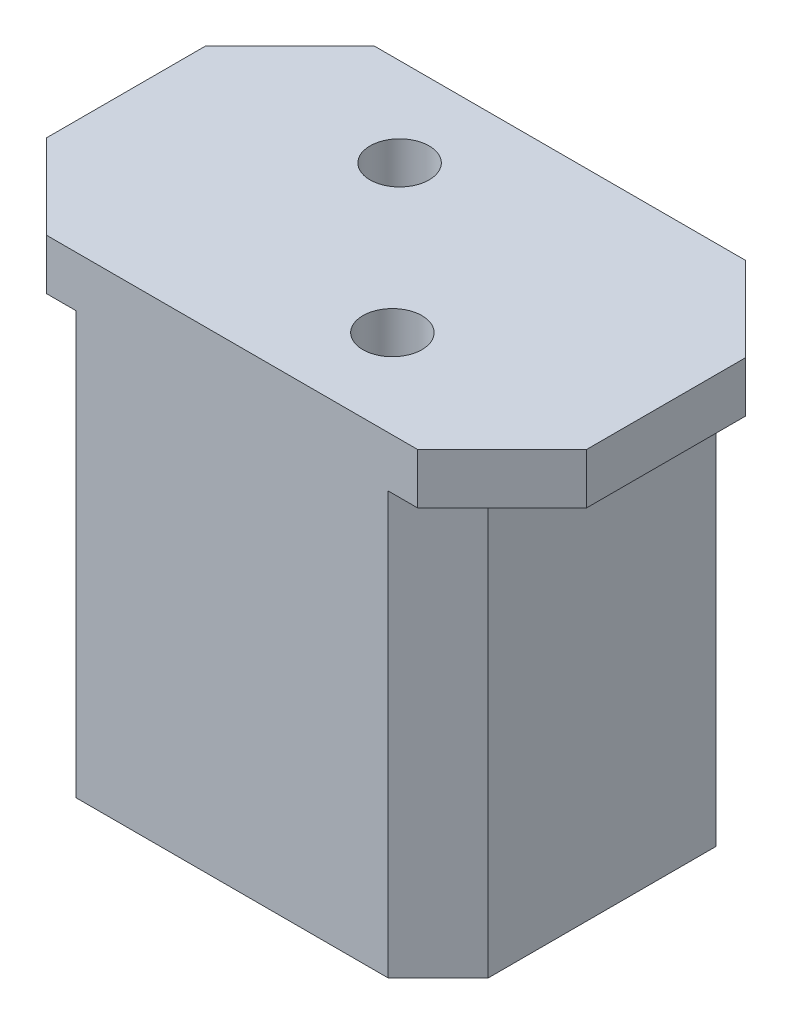
ISO-10303-21;
HEADER;
FILE_DESCRIPTION(('STEP AP214'),'2;1');
FILE_NAME('part.step','',(''),(''),'','','');
FILE_SCHEMA(('AUTOMOTIVE_DESIGN { 1 0 10303 214 1 1 1 1 }'));
ENDSEC;
DATA;
#1=APPLICATION_CONTEXT('core data for automotive mechanical design processes');
#2=APPLICATION_PROTOCOL_DEFINITION('international standard','automotive_design',2000,#1);
#3=PRODUCT_CONTEXT('',#1,'mechanical');
#4=PRODUCT('Part','Part','',(#3));
#5=PRODUCT_RELATED_PRODUCT_CATEGORY('part','',(#4));
#6=PRODUCT_DEFINITION_FORMATION('','',#4);
#7=PRODUCT_DEFINITION_CONTEXT('part definition',#1,'design');
#8=PRODUCT_DEFINITION('design','',#6,#7);
#9=PRODUCT_DEFINITION_SHAPE('','',#8);
#10=(LENGTH_UNIT() NAMED_UNIT(*) SI_UNIT(.MILLI.,.METRE.));
#11=(NAMED_UNIT(*) PLANE_ANGLE_UNIT() SI_UNIT($,.RADIAN.));
#12=(NAMED_UNIT(*) SI_UNIT($,.STERADIAN.) SOLID_ANGLE_UNIT());
#13=UNCERTAINTY_MEASURE_WITH_UNIT(LENGTH_MEASURE(1.E-05),#10,'distance_accuracy_value','');
#14=(GEOMETRIC_REPRESENTATION_CONTEXT(3) GLOBAL_UNCERTAINTY_ASSIGNED_CONTEXT((#13)) GLOBAL_UNIT_ASSIGNED_CONTEXT((#10,
#11,#12)) REPRESENTATION_CONTEXT('',''));
#15=CARTESIAN_POINT('',(0.,0.,0.));
#16=DIRECTION('',(0.,0.,1.));
#17=DIRECTION('',(1.,0.,0.));
#18=AXIS2_PLACEMENT_3D('',#15,#16,#17);
#19=CARTESIAN_POINT('',(2.96277741317163,25.,2.96277741317163));
#20=DIRECTION('',(0.707106781186547,0.,-0.707106781186547));
#21=DIRECTION('',(-0.707106781186548,0.,-0.707106781186548));
#22=AXIS2_PLACEMENT_3D('',#19,#20,#21);
#23=PLANE('',#22);
#24=DIRECTION('',(0.707106781186547,0.,0.707106781186547));
#25=VECTOR('',#24,1.);
#26=CARTESIAN_POINT('',(2.96277741317163,0.,2.96277741317163));
#27=LINE('',#26,#25);
#28=CARTESIAN_POINT('',(0.,0.,0.));
#29=VERTEX_POINT('',#28);
#30=CARTESIAN_POINT('',(2.96277741317163,0.,2.96277741317163));
#31=VERTEX_POINT('',#30);
#32=EDGE_CURVE('E224',#29,#31,#27,.T.);
#33=ORIENTED_EDGE('',*,*,#32,.T.);
#34=DIRECTION('',(0.,-1.,0.));
#35=VECTOR('',#34,1.);
#36=CARTESIAN_POINT('',(2.96277741317163,25.,2.96277741317163));
#37=LINE('',#36,#35);
#38=CARTESIAN_POINT('',(2.96277741317163,25.,2.96277741317163));
#39=VERTEX_POINT('',#38);
#40=EDGE_CURVE('E202',#39,#31,#37,.T.);
#41=ORIENTED_EDGE('',*,*,#40,.F.);
#42=DIRECTION('',(0.707106781186547,0.,0.707106781186547));
#43=VECTOR('',#42,1.);
#44=CARTESIAN_POINT('',(2.96277741317163,25.,2.96277741317163));
#45=LINE('',#44,#43);
#46=CARTESIAN_POINT('',(0.,25.,0.));
#47=VERTEX_POINT('',#46);
#48=EDGE_CURVE('E196',#47,#39,#45,.T.);
#49=ORIENTED_EDGE('',*,*,#48,.F.);
#50=DIRECTION('',(0.,-1.,0.));
#51=VECTOR('',#50,1.);
#52=CARTESIAN_POINT('',(0.,25.,0.));
#53=LINE('',#52,#51);
#54=EDGE_CURVE('E199',#47,#29,#53,.T.);
#55=ORIENTED_EDGE('',*,*,#54,.T.);
#56=EDGE_LOOP('',(#33,#41,#49,#55));
#57=FACE_BOUND('',#56,.T.);
#58=ADVANCED_FACE('F35',(#57),#23,.F.);
#59=CARTESIAN_POINT('',(21.4627774131716,25.,2.96277741317163));
#60=DIRECTION('',(0.,0.,-1.));
#61=DIRECTION('',(-1.,0.,0.));
#62=AXIS2_PLACEMENT_3D('',#59,#60,#61);
#63=PLANE('',#62);
#64=DIRECTION('',(1.,0.,0.));
#65=VECTOR('',#64,1.);
#66=CARTESIAN_POINT('',(-3.78722258682836,25.,2.96277741317163));
#67=LINE('',#66,#65);
#68=CARTESIAN_POINT('',(21.4627774131716,25.,2.96277741317163));
#69=VERTEX_POINT('',#68);
#70=CARTESIAN_POINT('',(23.2127774131716,25.,2.96277741317163));
#71=VERTEX_POINT('',#70);
#72=EDGE_CURVE('E307',#69,#71,#67,.T.);
#73=ORIENTED_EDGE('',*,*,#72,.T.);
#74=DIRECTION('',(0.,1.,0.));
#75=VECTOR('',#74,1.);
#76=CARTESIAN_POINT('',(23.2127774131716,25.,2.96277741317163));
#77=LINE('',#76,#75);
#78=CARTESIAN_POINT('',(23.2127774131716,28.,2.96277741317163));
#79=VERTEX_POINT('',#78);
#80=EDGE_CURVE('E269',#71,#79,#77,.T.);
#81=ORIENTED_EDGE('',*,*,#80,.T.);
#82=DIRECTION('',(1.,0.,0.));
#83=VECTOR('',#82,1.);
#84=CARTESIAN_POINT('',(-3.78722258682836,28.,2.96277741317163));
#85=LINE('',#84,#83);
#86=CARTESIAN_POINT('',(1.21277741317164,28.,2.96277741317163));
#87=VERTEX_POINT('',#86);
#88=EDGE_CURVE('E320',#87,#79,#85,.T.);
#89=ORIENTED_EDGE('',*,*,#88,.F.);
#90=DIRECTION('',(0.,-1.,0.));
#91=VECTOR('',#90,1.);
#92=CARTESIAN_POINT('',(1.21277741317164,25.,2.96277741317163));
#93=LINE('',#92,#91);
#94=CARTESIAN_POINT('',(1.21277741317164,25.,2.96277741317163));
#95=VERTEX_POINT('',#94);
#96=EDGE_CURVE('E266',#87,#95,#93,.T.);
#97=ORIENTED_EDGE('',*,*,#96,.T.);
#98=EDGE_CURVE('E313',#95,#39,#67,.T.);
#99=ORIENTED_EDGE('',*,*,#98,.T.);
#100=ORIENTED_EDGE('',*,*,#40,.T.);
#101=DIRECTION('',(1.,0.,0.));
#102=VECTOR('',#101,1.);
#103=CARTESIAN_POINT('',(21.4627774131716,0.,2.96277741317163));
#104=LINE('',#103,#102);
#105=CARTESIAN_POINT('',(21.4627774131716,0.,2.96277741317163));
#106=VERTEX_POINT('',#105);
#107=EDGE_CURVE('E226',#31,#106,#104,.T.);
#108=ORIENTED_EDGE('',*,*,#107,.T.);
#109=DIRECTION('',(0.,-1.,0.));
#110=VECTOR('',#109,1.);
#111=CARTESIAN_POINT('',(21.4627774131716,25.,2.96277741317163));
#112=LINE('',#111,#110);
#113=EDGE_CURVE('E253',#69,#106,#112,.T.);
#114=ORIENTED_EDGE('',*,*,#113,.F.);
#115=EDGE_LOOP('',(#73,#81,#89,#97,#99,#100,#108,#114));
#116=FACE_BOUND('',#115,.T.);
#117=ADVANCED_FACE('F435',(#116),#63,.F.);
#118=CARTESIAN_POINT('',(24.4255548263433,25.,0.));
#119=DIRECTION('',(-0.707106781186547,0.,-0.707106781186548));
#120=DIRECTION('',(-0.707106781186548,0.,0.707106781186547));
#121=AXIS2_PLACEMENT_3D('',#118,#119,#120);
#122=PLANE('',#121);
#123=DIRECTION('',(0.707106781186548,0.,-0.707106781186547));
#124=VECTOR('',#123,1.);
#125=CARTESIAN_POINT('',(24.4255548263433,0.,0.));
#126=LINE('',#125,#124);
#127=CARTESIAN_POINT('',(24.4255548263433,0.,0.));
#128=VERTEX_POINT('',#127);
#129=EDGE_CURVE('E229',#106,#128,#126,.T.);
#130=ORIENTED_EDGE('',*,*,#129,.T.);
#131=DIRECTION('',(0.,-1.,0.));
#132=VECTOR('',#131,1.);
#133=CARTESIAN_POINT('',(24.4255548263433,25.,0.));
#134=LINE('',#133,#132);
#135=CARTESIAN_POINT('',(24.4255548263433,25.,0.));
#136=VERTEX_POINT('',#135);
#137=EDGE_CURVE('E250',#136,#128,#134,.T.);
#138=ORIENTED_EDGE('',*,*,#137,.F.);
#139=DIRECTION('',(0.707106781186548,0.,-0.707106781186547));
#140=VECTOR('',#139,1.);
#141=CARTESIAN_POINT('',(24.4255548263433,25.,0.));
#142=LINE('',#141,#140);
#143=EDGE_CURVE('E204',#69,#136,#142,.T.);
#144=ORIENTED_EDGE('',*,*,#143,.F.);
#145=ORIENTED_EDGE('',*,*,#113,.T.);
#146=EDGE_LOOP('',(#130,#138,#144,#145));
#147=FACE_BOUND('',#146,.T.);
#148=ADVANCED_FACE('F442',(#147),#122,.F.);
#149=CARTESIAN_POINT('',(24.4255548263433,25.,-13.5));
#150=DIRECTION('',(-1.,0.,0.));
#151=DIRECTION('',(0.,0.,1.));
#152=AXIS2_PLACEMENT_3D('',#149,#150,#151);
#153=PLANE('',#152);
#154=DIRECTION('',(0.,0.,-1.));
#155=VECTOR('',#154,1.);
#156=CARTESIAN_POINT('',(24.4255548263433,0.,-13.5));
#157=LINE('',#156,#155);
#158=CARTESIAN_POINT('',(24.4255548263433,0.,-13.5));
#159=VERTEX_POINT('',#158);
#160=EDGE_CURVE('E231',#128,#159,#157,.T.);
#161=ORIENTED_EDGE('',*,*,#160,.T.);
#162=DIRECTION('',(0.,-1.,0.));
#163=VECTOR('',#162,1.);
#164=CARTESIAN_POINT('',(24.4255548263433,25.,-13.5));
#165=LINE('',#164,#163);
#166=CARTESIAN_POINT('',(24.4255548263433,25.,-13.5));
#167=VERTEX_POINT('',#166);
#168=EDGE_CURVE('E247',#167,#159,#165,.T.);
#169=ORIENTED_EDGE('',*,*,#168,.F.);
#170=DIRECTION('',(0.,0.,-1.));
#171=VECTOR('',#170,1.);
#172=CARTESIAN_POINT('',(24.4255548263433,25.,-13.5));
#173=LINE('',#172,#171);
#174=EDGE_CURVE('E380',#136,#167,#173,.T.);
#175=ORIENTED_EDGE('',*,*,#174,.F.);
#176=ORIENTED_EDGE('',*,*,#137,.T.);
#177=EDGE_LOOP('',(#161,#169,#175,#176));
#178=FACE_BOUND('',#177,.T.);
#179=ADVANCED_FACE('F385',(#178),#153,.F.);
#180=CARTESIAN_POINT('',(21.4627774131716,25.,-16.4627774131716));
#181=DIRECTION('',(-0.707106781186547,0.,0.707106781186547));
#182=DIRECTION('',(0.707106781186548,0.,0.707106781186548));
#183=AXIS2_PLACEMENT_3D('',#180,#181,#182);
#184=PLANE('',#183);
#185=DIRECTION('',(-0.707106781186547,0.,-0.707106781186547));
#186=VECTOR('',#185,1.);
#187=CARTESIAN_POINT('',(21.4627774131716,0.,-16.4627774131716));
#188=LINE('',#187,#186);
#189=CARTESIAN_POINT('',(21.4627774131716,0.,-16.4627774131716));
#190=VERTEX_POINT('',#189);
#191=EDGE_CURVE('E233',#159,#190,#188,.T.);
#192=ORIENTED_EDGE('',*,*,#191,.T.);
#193=DIRECTION('',(0.,-1.,0.));
#194=VECTOR('',#193,1.);
#195=CARTESIAN_POINT('',(21.4627774131716,25.,-16.4627774131716));
#196=LINE('',#195,#194);
#197=CARTESIAN_POINT('',(21.4627774131716,25.,-16.4627774131716));
#198=VERTEX_POINT('',#197);
#199=EDGE_CURVE('E244',#198,#190,#196,.T.);
#200=ORIENTED_EDGE('',*,*,#199,.F.);
#201=DIRECTION('',(-0.707106781186547,0.,-0.707106781186547));
#202=VECTOR('',#201,1.);
#203=CARTESIAN_POINT('',(21.4627774131716,25.,-16.4627774131716));
#204=LINE('',#203,#202);
#205=EDGE_CURVE('E220',#167,#198,#204,.T.);
#206=ORIENTED_EDGE('',*,*,#205,.F.);
#207=ORIENTED_EDGE('',*,*,#168,.T.);
#208=EDGE_LOOP('',(#192,#200,#206,#207));
#209=FACE_BOUND('',#208,.T.);
#210=ADVANCED_FACE('F389',(#209),#184,.F.);
#211=CARTESIAN_POINT('',(2.96277741317163,25.,-16.4627774131716));
#212=DIRECTION('',(0.,0.,1.));
#213=DIRECTION('',(1.,0.,0.));
#214=AXIS2_PLACEMENT_3D('',#211,#212,#213);
#215=PLANE('',#214);
#216=DIRECTION('',(-1.,0.,0.));
#217=VECTOR('',#216,1.);
#218=CARTESIAN_POINT('',(-3.78722258682836,25.,-16.4627774131716));
#219=LINE('',#218,#217);
#220=CARTESIAN_POINT('',(2.96277741317163,25.,-16.4627774131716));
#221=VERTEX_POINT('',#220);
#222=CARTESIAN_POINT('',(1.21277741317166,25.,-16.4627774131716));
#223=VERTEX_POINT('',#222);
#224=EDGE_CURVE('E305',#221,#223,#219,.T.);
#225=ORIENTED_EDGE('',*,*,#224,.T.);
#226=DIRECTION('',(0.,1.,0.));
#227=VECTOR('',#226,1.);
#228=CARTESIAN_POINT('',(1.21277741317166,25.,-16.4627774131716));
#229=LINE('',#228,#227);
#230=CARTESIAN_POINT('',(1.21277741317166,28.,-16.4627774131716));
#231=VERTEX_POINT('',#230);
#232=EDGE_CURVE('E12',#223,#231,#229,.T.);
#233=ORIENTED_EDGE('',*,*,#232,.T.);
#234=DIRECTION('',(-1.,0.,0.));
#235=VECTOR('',#234,1.);
#236=CARTESIAN_POINT('',(-3.78722258682836,28.,-16.4627774131716));
#237=LINE('',#236,#235);
#238=CARTESIAN_POINT('',(23.2127774131716,28.,-16.4627774131716));
#239=VERTEX_POINT('',#238);
#240=EDGE_CURVE('E294',#239,#231,#237,.T.);
#241=ORIENTED_EDGE('',*,*,#240,.F.);
#242=DIRECTION('',(0.,-1.,0.));
#243=VECTOR('',#242,1.);
#244=CARTESIAN_POINT('',(23.2127774131716,25.,-16.4627774131716));
#245=LINE('',#244,#243);
#246=CARTESIAN_POINT('',(23.2127774131716,25.,-16.4627774131716));
#247=VERTEX_POINT('',#246);
#248=EDGE_CURVE('E43',#239,#247,#245,.T.);
#249=ORIENTED_EDGE('',*,*,#248,.T.);
#250=EDGE_CURVE('E291',#247,#198,#219,.T.);
#251=ORIENTED_EDGE('',*,*,#250,.T.);
#252=ORIENTED_EDGE('',*,*,#199,.T.);
#253=DIRECTION('',(-1.,0.,0.));
#254=VECTOR('',#253,1.);
#255=CARTESIAN_POINT('',(2.96277741317163,0.,-16.4627774131716));
#256=LINE('',#255,#254);
#257=CARTESIAN_POINT('',(2.96277741317163,0.,-16.4627774131716));
#258=VERTEX_POINT('',#257);
#259=EDGE_CURVE('E235',#190,#258,#256,.T.);
#260=ORIENTED_EDGE('',*,*,#259,.T.);
#261=DIRECTION('',(0.,-1.,0.));
#262=VECTOR('',#261,1.);
#263=CARTESIAN_POINT('',(2.96277741317163,25.,-16.4627774131716));
#264=LINE('',#263,#262);
#265=EDGE_CURVE('E241',#221,#258,#264,.T.);
#266=ORIENTED_EDGE('',*,*,#265,.F.);
#267=EDGE_LOOP('',(#225,#233,#241,#249,#251,#252,#260,#266));
#268=FACE_BOUND('',#267,.T.);
#269=ADVANCED_FACE('F290',(#268),#215,.F.);
#270=CARTESIAN_POINT('',(0.,25.,-13.5));
#271=DIRECTION('',(0.707106781186548,0.,0.707106781186548));
#272=DIRECTION('',(0.707106781186548,0.,-0.707106781186548));
#273=AXIS2_PLACEMENT_3D('',#270,#271,#272);
#274=PLANE('',#273);
#275=DIRECTION('',(-0.707106781186548,0.,0.707106781186548));
#276=VECTOR('',#275,1.);
#277=CARTESIAN_POINT('',(0.,0.,-13.5));
#278=LINE('',#277,#276);
#279=CARTESIAN_POINT('',(0.,0.,-13.5));
#280=VERTEX_POINT('',#279);
#281=EDGE_CURVE('E237',#258,#280,#278,.T.);
#282=ORIENTED_EDGE('',*,*,#281,.T.);
#283=DIRECTION('',(0.,-1.,0.));
#284=VECTOR('',#283,1.);
#285=CARTESIAN_POINT('',(0.,25.,-13.5));
#286=LINE('',#285,#284);
#287=CARTESIAN_POINT('',(0.,25.,-13.5));
#288=VERTEX_POINT('',#287);
#289=EDGE_CURVE('E214',#288,#280,#286,.T.);
#290=ORIENTED_EDGE('',*,*,#289,.F.);
#291=DIRECTION('',(-0.707106781186548,0.,0.707106781186548));
#292=VECTOR('',#291,1.);
#293=CARTESIAN_POINT('',(0.,25.,-13.5));
#294=LINE('',#293,#292);
#295=EDGE_CURVE('E218',#221,#288,#294,.T.);
#296=ORIENTED_EDGE('',*,*,#295,.F.);
#297=ORIENTED_EDGE('',*,*,#265,.T.);
#298=EDGE_LOOP('',(#282,#290,#296,#297));
#299=FACE_BOUND('',#298,.T.);
#300=ADVANCED_FACE('F395',(#299),#274,.F.);
#301=CARTESIAN_POINT('',(0.,25.,0.));
#302=DIRECTION('',(1.,0.,0.));
#303=DIRECTION('',(0.,0.,-1.));
#304=AXIS2_PLACEMENT_3D('',#301,#302,#303);
#305=PLANE('',#304);
#306=DIRECTION('',(0.,0.,1.));
#307=VECTOR('',#306,1.);
#308=CARTESIAN_POINT('',(0.,0.,0.));
#309=LINE('',#308,#307);
#310=EDGE_CURVE('E205',#280,#29,#309,.T.);
#311=ORIENTED_EDGE('',*,*,#310,.T.);
#312=ORIENTED_EDGE('',*,*,#54,.F.);
#313=DIRECTION('',(0.,0.,1.));
#314=VECTOR('',#313,1.);
#315=CARTESIAN_POINT('',(0.,25.,0.));
#316=LINE('',#315,#314);
#317=EDGE_CURVE('E211',#288,#47,#316,.T.);
#318=ORIENTED_EDGE('',*,*,#317,.F.);
#319=ORIENTED_EDGE('',*,*,#289,.T.);
#320=EDGE_LOOP('',(#311,#312,#318,#319));
#321=FACE_BOUND('',#320,.T.);
#322=ADVANCED_FACE('F209',(#321),#305,.F.);
#323=CARTESIAN_POINT('',(0.,0.,0.));
#324=DIRECTION('',(0.,-1.,0.));
#325=DIRECTION('',(0.,0.,-1.));
#326=AXIS2_PLACEMENT_3D('',#323,#324,#325);
#327=PLANE('',#326);
#328=DIRECTION('',(0.,0.,1.));
#329=VECTOR('',#328,1.);
#330=CARTESIAN_POINT('',(20.7127774131716,0.,-6.53722258682837));
#331=LINE('',#330,#329);
#332=CARTESIAN_POINT('',(20.7127774131716,0.,-6.53722258682837));
#333=VERTEX_POINT('',#332);
#334=CARTESIAN_POINT('',(20.7127774131716,0.,1.96277741317163));
#335=VERTEX_POINT('',#334);
#336=EDGE_CURVE('E323',#333,#335,#331,.T.);
#337=ORIENTED_EDGE('',*,*,#336,.F.);
#338=DIRECTION('',(1.,0.,0.));
#339=VECTOR('',#338,1.);
#340=CARTESIAN_POINT('',(20.7127774131716,0.,-6.53722258682837));
#341=LINE('',#340,#339);
#342=CARTESIAN_POINT('',(12.2127774131716,0.,-6.53722258682837));
#343=VERTEX_POINT('',#342);
#344=EDGE_CURVE('E339',#343,#333,#341,.T.);
#345=ORIENTED_EDGE('',*,*,#344,.F.);
#346=DIRECTION('',(0.,0.,-1.));
#347=VECTOR('',#346,1.);
#348=CARTESIAN_POINT('',(12.2127774131716,0.,-6.53722258682837));
#349=LINE('',#348,#347);
#350=CARTESIAN_POINT('',(12.2127774131716,0.,1.96277741317163));
#351=VERTEX_POINT('',#350);
#352=EDGE_CURVE('E336',#351,#343,#349,.T.);
#353=ORIENTED_EDGE('',*,*,#352,.F.);
#354=DIRECTION('',(-1.,0.,0.));
#355=VECTOR('',#354,1.);
#356=CARTESIAN_POINT('',(20.7127774131716,0.,1.96277741317163));
#357=LINE('',#356,#355);
#358=EDGE_CURVE('E333',#335,#351,#357,.T.);
#359=ORIENTED_EDGE('',*,*,#358,.F.);
#360=EDGE_LOOP('',(#337,#345,#353,#359));
#361=FACE_BOUND('',#360,.T.);
#362=DIRECTION('',(0.,0.,1.));
#363=VECTOR('',#362,1.);
#364=CARTESIAN_POINT('',(12.2127774131716,0.,-15.4627774131716));
#365=LINE('',#364,#363);
#366=CARTESIAN_POINT('',(12.2127774131716,0.,-15.4627774131716));
#367=VERTEX_POINT('',#366);
#368=CARTESIAN_POINT('',(12.2127774131716,0.,-6.96277741317164));
#369=VERTEX_POINT('',#368);
#370=EDGE_CURVE('E351',#367,#369,#365,.T.);
#371=ORIENTED_EDGE('',*,*,#370,.F.);
#372=DIRECTION('',(1.,0.,0.));
#373=VECTOR('',#372,1.);
#374=CARTESIAN_POINT('',(12.2127774131716,0.,-15.4627774131716));
#375=LINE('',#374,#373);
#376=CARTESIAN_POINT('',(3.71277741317163,0.,-15.4627774131716));
#377=VERTEX_POINT('',#376);
#378=EDGE_CURVE('E366',#377,#367,#375,.T.);
#379=ORIENTED_EDGE('',*,*,#378,.F.);
#380=DIRECTION('',(0.,0.,-1.));
#381=VECTOR('',#380,1.);
#382=CARTESIAN_POINT('',(3.71277741317163,0.,-15.4627774131716));
#383=LINE('',#382,#381);
#384=CARTESIAN_POINT('',(3.71277741317163,0.,-6.96277741317164));
#385=VERTEX_POINT('',#384);
#386=EDGE_CURVE('E363',#385,#377,#383,.T.);
#387=ORIENTED_EDGE('',*,*,#386,.F.);
#388=DIRECTION('',(-1.,0.,0.));
#389=VECTOR('',#388,1.);
#390=CARTESIAN_POINT('',(12.2127774131716,0.,-6.96277741317164));
#391=LINE('',#390,#389);
#392=EDGE_CURVE('E360',#369,#385,#391,.T.);
#393=ORIENTED_EDGE('',*,*,#392,.F.);
#394=EDGE_LOOP('',(#371,#379,#387,#393));
#395=FACE_BOUND('',#394,.T.);
#396=ORIENTED_EDGE('',*,*,#32,.F.);
#397=ORIENTED_EDGE('',*,*,#310,.F.);
#398=ORIENTED_EDGE('',*,*,#281,.F.);
#399=ORIENTED_EDGE('',*,*,#259,.F.);
#400=ORIENTED_EDGE('',*,*,#191,.F.);
#401=ORIENTED_EDGE('',*,*,#160,.F.);
#402=ORIENTED_EDGE('',*,*,#129,.F.);
#403=ORIENTED_EDGE('',*,*,#107,.F.);
#404=EDGE_LOOP('',(#396,#397,#398,#399,#400,#401,#402,#403));
#405=FACE_BOUND('',#404,.T.);
#406=ADVANCED_FACE('F393',(#361,#395,#405),#327,.T.);
#407=CARTESIAN_POINT('',(12.2127774131716,37.0208152801713,-15.4627774131716));
#408=DIRECTION('',(1.,0.,0.));
#409=DIRECTION('',(0.,0.,-1.));
#410=AXIS2_PLACEMENT_3D('',#407,#408,#409);
#411=PLANE('',#410);
#412=DIRECTION('',(0.,0.,-1.));
#413=VECTOR('',#412,1.);
#414=CARTESIAN_POINT('',(12.2127774131716,20.,-15.4627774131716));
#415=LINE('',#414,#413);
#416=CARTESIAN_POINT('',(12.2127774131716,20.,-6.96277741317164));
#417=VERTEX_POINT('',#416);
#418=CARTESIAN_POINT('',(12.2127774131716,20.,-15.4627774131716));
#419=VERTEX_POINT('',#418);
#420=EDGE_CURVE('E357',#417,#419,#415,.T.);
#421=ORIENTED_EDGE('',*,*,#420,.T.);
#422=DIRECTION('',(0.,-1.,0.));
#423=VECTOR('',#422,1.);
#424=CARTESIAN_POINT('',(12.2127774131716,37.0208152801713,-15.4627774131716));
#425=LINE('',#424,#423);
#426=EDGE_CURVE('E355',#419,#367,#425,.T.);
#427=ORIENTED_EDGE('',*,*,#426,.T.);
#428=ORIENTED_EDGE('',*,*,#370,.T.);
#429=DIRECTION('',(0.,-1.,0.));
#430=VECTOR('',#429,1.);
#431=CARTESIAN_POINT('',(12.2127774131716,37.0208152801713,-6.96277741317164));
#432=LINE('',#431,#430);
#433=EDGE_CURVE('E369',#417,#369,#432,.T.);
#434=ORIENTED_EDGE('',*,*,#433,.F.);
#435=EDGE_LOOP('',(#421,#427,#428,#434));
#436=FACE_BOUND('',#435,.T.);
#437=ADVANCED_FACE('F486',(#436),#411,.F.);
#438=CARTESIAN_POINT('',(12.2127774131716,37.0208152801713,-15.4627774131716));
#439=DIRECTION('',(0.,0.,-1.));
#440=DIRECTION('',(-1.,0.,0.));
#441=AXIS2_PLACEMENT_3D('',#438,#439,#440);
#442=PLANE('',#441);
#443=DIRECTION('',(-1.,0.,0.));
#444=VECTOR('',#443,1.);
#445=CARTESIAN_POINT('',(12.2127774131716,20.,-15.4627774131716));
#446=LINE('',#445,#444);
#447=CARTESIAN_POINT('',(3.71277741317163,20.,-15.4627774131716));
#448=VERTEX_POINT('',#447);
#449=EDGE_CURVE('E354',#419,#448,#446,.T.);
#450=ORIENTED_EDGE('',*,*,#449,.T.);
#451=DIRECTION('',(0.,-1.,0.));
#452=VECTOR('',#451,1.);
#453=CARTESIAN_POINT('',(3.71277741317163,37.0208152801713,-15.4627774131716));
#454=LINE('',#453,#452);
#455=EDGE_CURVE('E371',#448,#377,#454,.T.);
#456=ORIENTED_EDGE('',*,*,#455,.T.);
#457=ORIENTED_EDGE('',*,*,#378,.T.);
#458=ORIENTED_EDGE('',*,*,#426,.F.);
#459=EDGE_LOOP('',(#450,#456,#457,#458));
#460=FACE_BOUND('',#459,.T.);
#461=ADVANCED_FACE('F490',(#460),#442,.F.);
#462=CARTESIAN_POINT('',(3.71277741317163,37.0208152801713,-15.4627774131716));
#463=DIRECTION('',(-1.,0.,0.));
#464=DIRECTION('',(0.,0.,1.));
#465=AXIS2_PLACEMENT_3D('',#462,#463,#464);
#466=PLANE('',#465);
#467=DIRECTION('',(0.,0.,1.));
#468=VECTOR('',#467,1.);
#469=CARTESIAN_POINT('',(3.71277741317163,20.,-15.4627774131716));
#470=LINE('',#469,#468);
#471=CARTESIAN_POINT('',(3.71277741317163,20.,-6.96277741317164));
#472=VERTEX_POINT('',#471);
#473=EDGE_CURVE('E352',#448,#472,#470,.T.);
#474=ORIENTED_EDGE('',*,*,#473,.T.);
#475=DIRECTION('',(0.,-1.,0.));
#476=VECTOR('',#475,1.);
#477=CARTESIAN_POINT('',(3.71277741317163,37.0208152801713,-6.96277741317164));
#478=LINE('',#477,#476);
#479=EDGE_CURVE('E373',#472,#385,#478,.T.);
#480=ORIENTED_EDGE('',*,*,#479,.T.);
#481=ORIENTED_EDGE('',*,*,#386,.T.);
#482=ORIENTED_EDGE('',*,*,#455,.F.);
#483=EDGE_LOOP('',(#474,#480,#481,#482));
#484=FACE_BOUND('',#483,.T.);
#485=ADVANCED_FACE('F496',(#484),#466,.F.);
#486=CARTESIAN_POINT('',(12.2127774131716,37.0208152801713,-6.96277741317164));
#487=DIRECTION('',(0.,0.,1.));
#488=DIRECTION('',(1.,0.,0.));
#489=AXIS2_PLACEMENT_3D('',#486,#487,#488);
#490=PLANE('',#489);
#491=DIRECTION('',(1.,0.,0.));
#492=VECTOR('',#491,1.);
#493=CARTESIAN_POINT('',(12.2127774131716,20.,-6.96277741317164));
#494=LINE('',#493,#492);
#495=EDGE_CURVE('E227',#472,#417,#494,.T.);
#496=ORIENTED_EDGE('',*,*,#495,.T.);
#497=ORIENTED_EDGE('',*,*,#433,.T.);
#498=ORIENTED_EDGE('',*,*,#392,.T.);
#499=ORIENTED_EDGE('',*,*,#479,.F.);
#500=EDGE_LOOP('',(#496,#497,#498,#499));
#501=FACE_BOUND('',#500,.T.);
#502=ADVANCED_FACE('F492',(#501),#490,.F.);
#503=CARTESIAN_POINT('',(0.,20.,0.));
#504=DIRECTION('',(0.,-1.,0.));
#505=DIRECTION('',(0.,0.,-1.));
#506=AXIS2_PLACEMENT_3D('',#503,#504,#505);
#507=PLANE('',#506);
#508=CARTESIAN_POINT('',(7.96277741317164,20.,-11.2127774131716));
#509=DIRECTION('',(0.,-1.,0.));
#510=DIRECTION('',(0.,0.,-1.));
#511=AXIS2_PLACEMENT_3D('',#508,#509,#510);
#512=CIRCLE('',#511,1.75);
#513=CARTESIAN_POINT('',(7.96277741317164,20.,-12.9627774131716));
#514=VERTEX_POINT('',#513);
#515=EDGE_CURVE('E319',#514,#514,#512,.T.);
#516=ORIENTED_EDGE('',*,*,#515,.F.);
#517=EDGE_LOOP('',(#516));
#518=FACE_BOUND('',#517,.T.);
#519=ORIENTED_EDGE('',*,*,#420,.F.);
#520=ORIENTED_EDGE('',*,*,#495,.F.);
#521=ORIENTED_EDGE('',*,*,#473,.F.);
#522=ORIENTED_EDGE('',*,*,#449,.F.);
#523=EDGE_LOOP('',(#519,#520,#521,#522));
#524=FACE_BOUND('',#523,.T.);
#525=ADVANCED_FACE('F495',(#518,#524),#507,.T.);
#526=CARTESIAN_POINT('',(20.7127774131716,37.0208152801713,-6.53722258682837));
#527=DIRECTION('',(1.,0.,0.));
#528=DIRECTION('',(0.,0.,-1.));
#529=AXIS2_PLACEMENT_3D('',#526,#527,#528);
#530=PLANE('',#529);
#531=DIRECTION('',(0.,0.,-1.));
#532=VECTOR('',#531,1.);
#533=CARTESIAN_POINT('',(20.7127774131716,20.,-6.53722258682837));
#534=LINE('',#533,#532);
#535=CARTESIAN_POINT('',(20.7127774131716,20.,1.96277741317163));
#536=VERTEX_POINT('',#535);
#537=CARTESIAN_POINT('',(20.7127774131716,20.,-6.53722258682837));
#538=VERTEX_POINT('',#537);
#539=EDGE_CURVE('E329',#536,#538,#534,.T.);
#540=ORIENTED_EDGE('',*,*,#539,.T.);
#541=DIRECTION('',(0.,-1.,0.));
#542=VECTOR('',#541,1.);
#543=CARTESIAN_POINT('',(20.7127774131716,37.0208152801713,-6.53722258682837));
#544=LINE('',#543,#542);
#545=EDGE_CURVE('E327',#538,#333,#544,.T.);
#546=ORIENTED_EDGE('',*,*,#545,.T.);
#547=ORIENTED_EDGE('',*,*,#336,.T.);
#548=DIRECTION('',(0.,-1.,0.));
#549=VECTOR('',#548,1.);
#550=CARTESIAN_POINT('',(20.7127774131716,37.0208152801713,1.96277741317163));
#551=LINE('',#550,#549);
#552=EDGE_CURVE('E342',#536,#335,#551,.T.);
#553=ORIENTED_EDGE('',*,*,#552,.F.);
#554=EDGE_LOOP('',(#540,#546,#547,#553));
#555=FACE_BOUND('',#554,.T.);
#556=ADVANCED_FACE('F506',(#555),#530,.F.);
#557=CARTESIAN_POINT('',(20.7127774131716,37.0208152801713,-6.53722258682837));
#558=DIRECTION('',(0.,0.,-1.));
#559=DIRECTION('',(-1.,0.,0.));
#560=AXIS2_PLACEMENT_3D('',#557,#558,#559);
#561=PLANE('',#560);
#562=DIRECTION('',(-1.,0.,0.));
#563=VECTOR('',#562,1.);
#564=CARTESIAN_POINT('',(20.7127774131716,20.,-6.53722258682837));
#565=LINE('',#564,#563);
#566=CARTESIAN_POINT('',(12.2127774131716,20.,-6.53722258682837));
#567=VERTEX_POINT('',#566);
#568=EDGE_CURVE('E326',#538,#567,#565,.T.);
#569=ORIENTED_EDGE('',*,*,#568,.T.);
#570=DIRECTION('',(0.,-1.,0.));
#571=VECTOR('',#570,1.);
#572=CARTESIAN_POINT('',(12.2127774131716,37.0208152801713,-6.53722258682837));
#573=LINE('',#572,#571);
#574=EDGE_CURVE('E344',#567,#343,#573,.T.);
#575=ORIENTED_EDGE('',*,*,#574,.T.);
#576=ORIENTED_EDGE('',*,*,#344,.T.);
#577=ORIENTED_EDGE('',*,*,#545,.F.);
#578=EDGE_LOOP('',(#569,#575,#576,#577));
#579=FACE_BOUND('',#578,.T.);
#580=ADVANCED_FACE('F510',(#579),#561,.F.);
#581=CARTESIAN_POINT('',(12.2127774131716,37.0208152801713,-6.53722258682837));
#582=DIRECTION('',(-1.,0.,0.));
#583=DIRECTION('',(0.,0.,1.));
#584=AXIS2_PLACEMENT_3D('',#581,#582,#583);
#585=PLANE('',#584);
#586=DIRECTION('',(0.,0.,1.));
#587=VECTOR('',#586,1.);
#588=CARTESIAN_POINT('',(12.2127774131716,20.,-6.53722258682837));
#589=LINE('',#588,#587);
#590=CARTESIAN_POINT('',(12.2127774131716,20.,1.96277741317163));
#591=VERTEX_POINT('',#590);
#592=EDGE_CURVE('E324',#567,#591,#589,.T.);
#593=ORIENTED_EDGE('',*,*,#592,.T.);
#594=DIRECTION('',(0.,-1.,0.));
#595=VECTOR('',#594,1.);
#596=CARTESIAN_POINT('',(12.2127774131716,37.0208152801713,1.96277741317163));
#597=LINE('',#596,#595);
#598=EDGE_CURVE('E346',#591,#351,#597,.T.);
#599=ORIENTED_EDGE('',*,*,#598,.T.);
#600=ORIENTED_EDGE('',*,*,#352,.T.);
#601=ORIENTED_EDGE('',*,*,#574,.F.);
#602=EDGE_LOOP('',(#593,#599,#600,#601));
#603=FACE_BOUND('',#602,.T.);
#604=ADVANCED_FACE('F516',(#603),#585,.F.);
#605=CARTESIAN_POINT('',(20.7127774131716,37.0208152801713,1.96277741317163));
#606=DIRECTION('',(0.,0.,1.));
#607=DIRECTION('',(1.,0.,0.));
#608=AXIS2_PLACEMENT_3D('',#605,#606,#607);
#609=PLANE('',#608);
#610=DIRECTION('',(1.,0.,0.));
#611=VECTOR('',#610,1.);
#612=CARTESIAN_POINT('',(20.7127774131716,20.,1.96277741317163));
#613=LINE('',#612,#611);
#614=EDGE_CURVE('E331',#591,#536,#613,.T.);
#615=ORIENTED_EDGE('',*,*,#614,.T.);
#616=ORIENTED_EDGE('',*,*,#552,.T.);
#617=ORIENTED_EDGE('',*,*,#358,.T.);
#618=ORIENTED_EDGE('',*,*,#598,.F.);
#619=EDGE_LOOP('',(#615,#616,#617,#618));
#620=FACE_BOUND('',#619,.T.);
#621=ADVANCED_FACE('F512',(#620),#609,.F.);
#622=CARTESIAN_POINT('',(0.,20.,0.));
#623=DIRECTION('',(0.,-1.,0.));
#624=DIRECTION('',(0.,0.,-1.));
#625=AXIS2_PLACEMENT_3D('',#622,#623,#624);
#626=PLANE('',#625);
#627=CARTESIAN_POINT('',(16.4627774131716,20.,-2.28722258682837));
#628=DIRECTION('',(0.,-1.,0.));
#629=DIRECTION('',(0.,0.,-1.));
#630=AXIS2_PLACEMENT_3D('',#627,#628,#629);
#631=CIRCLE('',#630,1.75);
#632=CARTESIAN_POINT('',(16.4627774131716,20.,-4.03722258682837));
#633=VERTEX_POINT('',#632);
#634=EDGE_CURVE('E316',#633,#633,#631,.T.);
#635=ORIENTED_EDGE('',*,*,#634,.F.);
#636=EDGE_LOOP('',(#635));
#637=FACE_BOUND('',#636,.T.);
#638=ORIENTED_EDGE('',*,*,#539,.F.);
#639=ORIENTED_EDGE('',*,*,#614,.F.);
#640=ORIENTED_EDGE('',*,*,#592,.F.);
#641=ORIENTED_EDGE('',*,*,#568,.F.);
#642=EDGE_LOOP('',(#638,#639,#640,#641));
#643=FACE_BOUND('',#642,.T.);
#644=ADVANCED_FACE('F515',(#637,#643),#626,.T.);
#645=CARTESIAN_POINT('',(7.96277741317164,33.,-11.2127774131716));
#646=DIRECTION('',(0.,-1.,0.));
#647=DIRECTION('',(0.,0.,-1.));
#648=AXIS2_PLACEMENT_3D('',#645,#646,#647);
#649=CYLINDRICAL_SURFACE('',#648,1.75);
#650=ORIENTED_EDGE('',*,*,#515,.T.);
#651=EDGE_LOOP('',(#650));
#652=FACE_BOUND('',#651,.T.);
#653=CARTESIAN_POINT('',(7.96277741317164,28.,-11.2127774131716));
#654=DIRECTION('',(0.,1.,0.));
#655=DIRECTION('',(0.,0.,1.));
#656=AXIS2_PLACEMENT_3D('',#653,#654,#655);
#657=CIRCLE('',#656,1.75);
#658=CARTESIAN_POINT('',(7.96277741317164,28.,-9.46277741317164));
#659=VERTEX_POINT('',#658);
#660=EDGE_CURVE('E417',#659,#659,#657,.T.);
#661=ORIENTED_EDGE('',*,*,#660,.T.);
#662=EDGE_LOOP('',(#661));
#663=FACE_BOUND('',#662,.T.);
#664=ADVANCED_FACE('F525',(#652,#663),#649,.F.);
#665=CARTESIAN_POINT('',(16.4627774131716,33.,-2.28722258682837));
#666=DIRECTION('',(0.,-1.,0.));
#667=DIRECTION('',(0.,0.,-1.));
#668=AXIS2_PLACEMENT_3D('',#665,#666,#667);
#669=CYLINDRICAL_SURFACE('',#668,1.75);
#670=ORIENTED_EDGE('',*,*,#634,.T.);
#671=EDGE_LOOP('',(#670));
#672=FACE_BOUND('',#671,.T.);
#673=CARTESIAN_POINT('',(16.4627774131716,28.,-2.28722258682837));
#674=DIRECTION('',(0.,1.,0.));
#675=DIRECTION('',(0.,0.,1.));
#676=AXIS2_PLACEMENT_3D('',#673,#674,#675);
#677=CIRCLE('',#676,1.75);
#678=CARTESIAN_POINT('',(16.4627774131716,28.,-0.537222586828374));
#679=VERTEX_POINT('',#678);
#680=EDGE_CURVE('E420',#679,#679,#677,.T.);
#681=ORIENTED_EDGE('',*,*,#680,.T.);
#682=EDGE_LOOP('',(#681));
#683=FACE_BOUND('',#682,.T.);
#684=ADVANCED_FACE('F424',(#672,#683),#669,.F.);
#685=CARTESIAN_POINT('',(0.,25.,0.));
#686=DIRECTION('',(0.,-1.,0.));
#687=DIRECTION('',(0.,0.,-1.));
#688=AXIS2_PLACEMENT_3D('',#685,#686,#687);
#689=PLANE('',#688);
#690=DIRECTION('',(0.,0.,-1.));
#691=VECTOR('',#690,1.);
#692=CARTESIAN_POINT('',(28.2127774131716,25.,2.96277741317163));
#693=LINE('',#692,#691);
#694=CARTESIAN_POINT('',(28.2127774131716,25.,-2.03722258682837));
#695=VERTEX_POINT('',#694);
#696=CARTESIAN_POINT('',(28.2127774131716,25.,-11.4627774131716));
#697=VERTEX_POINT('',#696);
#698=EDGE_CURVE('E309',#695,#697,#693,.T.);
#699=ORIENTED_EDGE('',*,*,#698,.F.);
#700=DIRECTION('',(0.707106781186549,0.,-0.707106781186547));
#701=VECTOR('',#700,1.);
#702=CARTESIAN_POINT('',(13.0877774131716,25.,13.0877774131716));
#703=LINE('',#702,#701);
#704=EDGE_CURVE('E264',#695,#71,#703,.F.);
#705=ORIENTED_EDGE('',*,*,#704,.T.);
#706=ORIENTED_EDGE('',*,*,#72,.F.);
#707=ORIENTED_EDGE('',*,*,#143,.T.);
#708=ORIENTED_EDGE('',*,*,#174,.T.);
#709=ORIENTED_EDGE('',*,*,#205,.T.);
#710=ORIENTED_EDGE('',*,*,#250,.F.);
#711=DIRECTION('',(-0.707106781186546,0.,-0.707106781186549));
#712=VECTOR('',#711,1.);
#713=CARTESIAN_POINT('',(19.8377774131717,25.,-19.8377774131716));
#714=LINE('',#713,#712);
#715=EDGE_CURVE('E262',#247,#697,#714,.F.);
#716=ORIENTED_EDGE('',*,*,#715,.T.);
#717=EDGE_LOOP('',(#699,#705,#706,#707,#708,#709,#710,#716));
#718=FACE_BOUND('',#717,.T.);
#719=ADVANCED_FACE('F300',(#718),#689,.T.);
#720=CARTESIAN_POINT('',(0.,28.,0.));
#721=DIRECTION('',(0.,-1.,0.));
#722=DIRECTION('',(0.,0.,-1.));
#723=AXIS2_PLACEMENT_3D('',#720,#721,#722);
#724=PLANE('',#723);
#725=ORIENTED_EDGE('',*,*,#88,.T.);
#726=DIRECTION('',(-0.707106781186549,0.,0.707106781186547));
#727=VECTOR('',#726,1.);
#728=CARTESIAN_POINT('',(28.2127774131716,28.,-2.03722258682837));
#729=LINE('',#728,#727);
#730=CARTESIAN_POINT('',(28.2127774131716,28.,-2.03722258682837));
#731=VERTEX_POINT('',#730);
#732=EDGE_CURVE('E277',#79,#731,#729,.F.);
#733=ORIENTED_EDGE('',*,*,#732,.T.);
#734=DIRECTION('',(0.,0.,-1.));
#735=VECTOR('',#734,1.);
#736=CARTESIAN_POINT('',(28.2127774131716,28.,2.96277741317163));
#737=LINE('',#736,#735);
#738=CARTESIAN_POINT('',(28.2127774131716,28.,-11.4627774131716));
#739=VERTEX_POINT('',#738);
#740=EDGE_CURVE('E315',#731,#739,#737,.T.);
#741=ORIENTED_EDGE('',*,*,#740,.T.);
#742=DIRECTION('',(0.707106781186546,0.,0.707106781186549));
#743=VECTOR('',#742,1.);
#744=CARTESIAN_POINT('',(23.2127774131716,28.,-16.4627774131716));
#745=LINE('',#744,#743);
#746=EDGE_CURVE('E271',#739,#239,#745,.F.);
#747=ORIENTED_EDGE('',*,*,#746,.T.);
#748=ORIENTED_EDGE('',*,*,#240,.T.);
#749=DIRECTION('',(0.707106781186549,0.,-0.707106781186546));
#750=VECTOR('',#749,1.);
#751=CARTESIAN_POINT('',(-3.78722258682836,28.,-11.4627774131716));
#752=LINE('',#751,#750);
#753=CARTESIAN_POINT('',(-3.78722258682836,28.,-11.4627774131716));
#754=VERTEX_POINT('',#753);
#755=EDGE_CURVE('E273',#231,#754,#752,.F.);
#756=ORIENTED_EDGE('',*,*,#755,.T.);
#757=DIRECTION('',(0.,0.,1.));
#758=VECTOR('',#757,1.);
#759=CARTESIAN_POINT('',(-3.78722258682836,28.,2.96277741317163));
#760=LINE('',#759,#758);
#761=CARTESIAN_POINT('',(-3.78722258682836,28.,-2.03722258682839));
#762=VERTEX_POINT('',#761);
#763=EDGE_CURVE('E407',#754,#762,#760,.T.);
#764=ORIENTED_EDGE('',*,*,#763,.T.);
#765=DIRECTION('',(-0.707106781186546,0.,-0.707106781186549));
#766=VECTOR('',#765,1.);
#767=CARTESIAN_POINT('',(1.21277741317164,28.,2.96277741317163));
#768=LINE('',#767,#766);
#769=EDGE_CURVE('E275',#762,#87,#768,.F.);
#770=ORIENTED_EDGE('',*,*,#769,.T.);
#771=EDGE_LOOP('',(#725,#733,#741,#747,#748,#756,#764,#770));
#772=FACE_BOUND('',#771,.T.);
#773=ORIENTED_EDGE('',*,*,#660,.F.);
#774=EDGE_LOOP('',(#773));
#775=FACE_BOUND('',#774,.T.);
#776=ORIENTED_EDGE('',*,*,#680,.F.);
#777=EDGE_LOOP('',(#776));
#778=FACE_BOUND('',#777,.T.);
#779=ADVANCED_FACE('F405',(#772,#775,#778),#724,.F.);
#780=ORIENTED_EDGE('',*,*,#98,.F.);
#781=DIRECTION('',(0.707106781186546,0.,0.707106781186549));
#782=VECTOR('',#781,1.);
#783=CARTESIAN_POINT('',(-0.874999999999992,25.,0.874999999999988));
#784=LINE('',#783,#782);
#785=CARTESIAN_POINT('',(-3.78722258682836,25.,-2.03722258682839));
#786=VERTEX_POINT('',#785);
#787=EDGE_CURVE('E56',#95,#786,#784,.F.);
#788=ORIENTED_EDGE('',*,*,#787,.T.);
#789=DIRECTION('',(0.,0.,1.));
#790=VECTOR('',#789,1.);
#791=CARTESIAN_POINT('',(-3.78722258682836,25.,2.96277741317163));
#792=LINE('',#791,#790);
#793=CARTESIAN_POINT('',(-3.78722258682836,25.,-11.4627774131716));
#794=VERTEX_POINT('',#793);
#795=EDGE_CURVE('E304',#794,#786,#792,.T.);
#796=ORIENTED_EDGE('',*,*,#795,.F.);
#797=DIRECTION('',(-0.707106781186549,0.,0.707106781186546));
#798=VECTOR('',#797,1.);
#799=CARTESIAN_POINT('',(-7.62499999999999,25.,-7.62500000000002));
#800=LINE('',#799,#798);
#801=EDGE_CURVE('E50',#794,#223,#800,.F.);
#802=ORIENTED_EDGE('',*,*,#801,.T.);
#803=ORIENTED_EDGE('',*,*,#224,.F.);
#804=ORIENTED_EDGE('',*,*,#295,.T.);
#805=ORIENTED_EDGE('',*,*,#317,.T.);
#806=ORIENTED_EDGE('',*,*,#48,.T.);
#807=EDGE_LOOP('',(#780,#788,#796,#802,#803,#804,#805,#806));
#808=FACE_BOUND('',#807,.T.);
#809=ADVANCED_FACE('F216',(#808),#689,.T.);
#810=CARTESIAN_POINT('',(28.2127774131716,28.,2.96277741317163));
#811=DIRECTION('',(-1.,0.,0.));
#812=DIRECTION('',(0.,0.,1.));
#813=AXIS2_PLACEMENT_3D('',#810,#811,#812);
#814=PLANE('',#813);
#815=ORIENTED_EDGE('',*,*,#740,.F.);
#816=DIRECTION('',(0.,-1.,0.));
#817=VECTOR('',#816,1.);
#818=CARTESIAN_POINT('',(28.2127774131716,28.,-2.03722258682837));
#819=LINE('',#818,#817);
#820=EDGE_CURVE('E259',#731,#695,#819,.T.);
#821=ORIENTED_EDGE('',*,*,#820,.T.);
#822=ORIENTED_EDGE('',*,*,#698,.T.);
#823=DIRECTION('',(0.,1.,0.));
#824=VECTOR('',#823,1.);
#825=CARTESIAN_POINT('',(28.2127774131716,28.,-11.4627774131716));
#826=LINE('',#825,#824);
#827=EDGE_CURVE('E257',#697,#739,#826,.T.);
#828=ORIENTED_EDGE('',*,*,#827,.T.);
#829=EDGE_LOOP('',(#815,#821,#822,#828));
#830=FACE_BOUND('',#829,.T.);
#831=ADVANCED_FACE('F432',(#830),#814,.F.);
#832=CARTESIAN_POINT('',(-3.78722258682836,28.,2.96277741317163));
#833=DIRECTION('',(1.,0.,0.));
#834=DIRECTION('',(0.,0.,-1.));
#835=AXIS2_PLACEMENT_3D('',#832,#833,#834);
#836=PLANE('',#835);
#837=ORIENTED_EDGE('',*,*,#795,.T.);
#838=DIRECTION('',(0.,1.,0.));
#839=VECTOR('',#838,1.);
#840=CARTESIAN_POINT('',(-3.78722258682836,28.,-2.03722258682839));
#841=LINE('',#840,#839);
#842=EDGE_CURVE('E284',#786,#762,#841,.T.);
#843=ORIENTED_EDGE('',*,*,#842,.T.);
#844=ORIENTED_EDGE('',*,*,#763,.F.);
#845=DIRECTION('',(0.,-1.,0.));
#846=VECTOR('',#845,1.);
#847=CARTESIAN_POINT('',(-3.78722258682836,28.,-11.4627774131716));
#848=LINE('',#847,#846);
#849=EDGE_CURVE('E281',#754,#794,#848,.T.);
#850=ORIENTED_EDGE('',*,*,#849,.T.);
#851=EDGE_LOOP('',(#837,#843,#844,#850));
#852=FACE_BOUND('',#851,.T.);
#853=ADVANCED_FACE('F410',(#852),#836,.F.);
#854=CARTESIAN_POINT('',(28.2127774131716,28.,-2.03722258682837));
#855=DIRECTION('',(-0.707106781186547,0.,-0.707106781186549));
#856=DIRECTION('',(0.,-1.,0.));
#857=AXIS2_PLACEMENT_3D('',#854,#855,#856);
#858=PLANE('',#857);
#859=ORIENTED_EDGE('',*,*,#732,.F.);
#860=ORIENTED_EDGE('',*,*,#80,.F.);
#861=ORIENTED_EDGE('',*,*,#704,.F.);
#862=ORIENTED_EDGE('',*,*,#820,.F.);
#863=EDGE_LOOP('',(#859,#860,#861,#862));
#864=FACE_BOUND('',#863,.T.);
#865=ADVANCED_FACE('F447',(#864),#858,.F.);
#866=CARTESIAN_POINT('',(1.21277741317164,25.,2.96277741317163));
#867=DIRECTION('',(0.707106781186549,0.,-0.707106781186546));
#868=DIRECTION('',(0.,-1.,0.));
#869=AXIS2_PLACEMENT_3D('',#866,#867,#868);
#870=PLANE('',#869);
#871=ORIENTED_EDGE('',*,*,#769,.F.);
#872=ORIENTED_EDGE('',*,*,#842,.F.);
#873=ORIENTED_EDGE('',*,*,#787,.F.);
#874=ORIENTED_EDGE('',*,*,#96,.F.);
#875=EDGE_LOOP('',(#871,#872,#873,#874));
#876=FACE_BOUND('',#875,.T.);
#877=ADVANCED_FACE('F450',(#876),#870,.F.);
#878=CARTESIAN_POINT('',(-3.78722258682836,28.,-11.4627774131716));
#879=DIRECTION('',(0.707106781186546,0.,0.707106781186549));
#880=DIRECTION('',(0.,-1.,0.));
#881=AXIS2_PLACEMENT_3D('',#878,#879,#880);
#882=PLANE('',#881);
#883=ORIENTED_EDGE('',*,*,#755,.F.);
#884=ORIENTED_EDGE('',*,*,#232,.F.);
#885=ORIENTED_EDGE('',*,*,#801,.F.);
#886=ORIENTED_EDGE('',*,*,#849,.F.);
#887=EDGE_LOOP('',(#883,#884,#885,#886));
#888=FACE_BOUND('',#887,.T.);
#889=ADVANCED_FACE('F399',(#888),#882,.F.);
#890=CARTESIAN_POINT('',(23.2127774131716,25.,-16.4627774131716));
#891=DIRECTION('',(-0.707106781186549,0.,0.707106781186546));
#892=DIRECTION('',(0.,-1.,0.));
#893=AXIS2_PLACEMENT_3D('',#890,#891,#892);
#894=PLANE('',#893);
#895=ORIENTED_EDGE('',*,*,#746,.F.);
#896=ORIENTED_EDGE('',*,*,#827,.F.);
#897=ORIENTED_EDGE('',*,*,#715,.F.);
#898=ORIENTED_EDGE('',*,*,#248,.F.);
#899=EDGE_LOOP('',(#895,#896,#897,#898));
#900=FACE_BOUND('',#899,.T.);
#901=ADVANCED_FACE('F37',(#900),#894,.F.);
#902=CLOSED_SHELL('',(#58,#117,#148,#179,#210,#269,#300,#322,#406,#437,#461,#485,#502,#525,#556,
#580,#604,#621,#644,#664,#684,#719,#779,#809,#831,#853,#865,#877,#889,#901));
#903=MANIFOLD_SOLID_BREP('B2',#902);
#904=ADVANCED_BREP_SHAPE_REPRESENTATION('',(#18,#903),#14);
#905=SHAPE_DEFINITION_REPRESENTATION(#9,#904);
ENDSEC;
END-ISO-10303-21;
